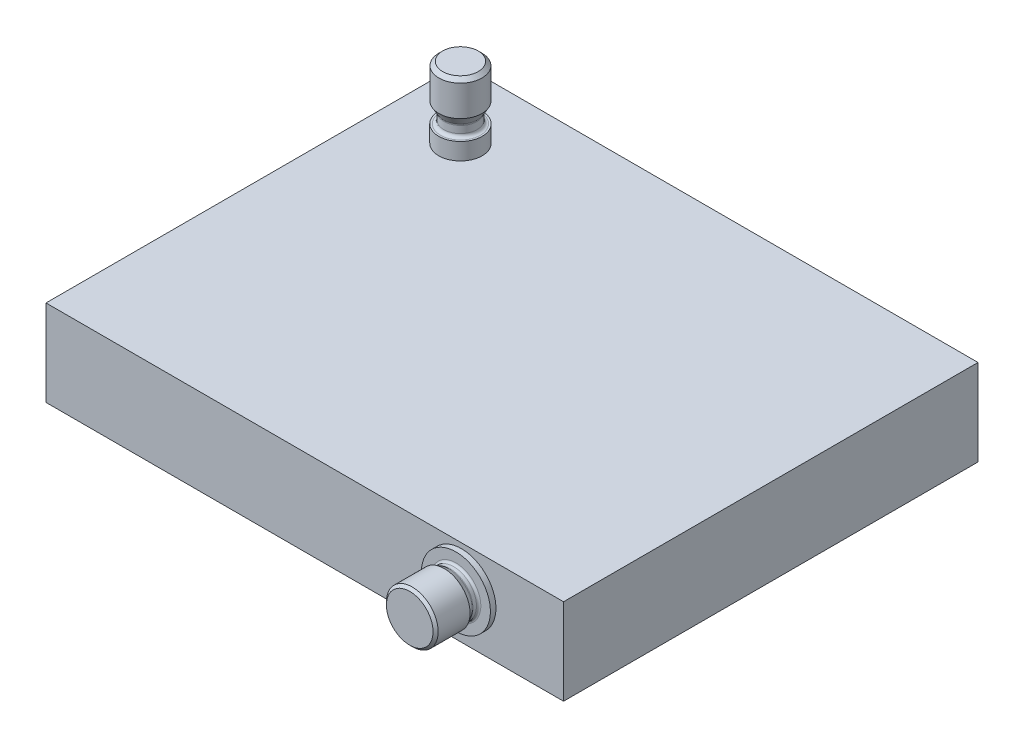
ISO-10303-21;
HEADER;
FILE_DESCRIPTION(('STEP AP214'),'2;1');
FILE_NAME('part.step','',(''),(''),'','','');
FILE_SCHEMA(('AUTOMOTIVE_DESIGN { 1 0 10303 214 1 1 1 1 }'));
ENDSEC;
DATA;
#1=APPLICATION_CONTEXT('core data for automotive mechanical design processes');
#2=APPLICATION_PROTOCOL_DEFINITION('international standard','automotive_design',2000,#1);
#3=PRODUCT_CONTEXT('',#1,'mechanical');
#4=PRODUCT('Part','Part','',(#3));
#5=PRODUCT_RELATED_PRODUCT_CATEGORY('part','',(#4));
#6=PRODUCT_DEFINITION_FORMATION('','',#4);
#7=PRODUCT_DEFINITION_CONTEXT('part definition',#1,'design');
#8=PRODUCT_DEFINITION('design','',#6,#7);
#9=PRODUCT_DEFINITION_SHAPE('','',#8);
#10=(LENGTH_UNIT() NAMED_UNIT(*) SI_UNIT(.MILLI.,.METRE.));
#11=(NAMED_UNIT(*) PLANE_ANGLE_UNIT() SI_UNIT($,.RADIAN.));
#12=(NAMED_UNIT(*) SI_UNIT($,.STERADIAN.) SOLID_ANGLE_UNIT());
#13=UNCERTAINTY_MEASURE_WITH_UNIT(LENGTH_MEASURE(1.E-05),#10,'distance_accuracy_value','');
#14=(GEOMETRIC_REPRESENTATION_CONTEXT(3) GLOBAL_UNCERTAINTY_ASSIGNED_CONTEXT((#13)) GLOBAL_UNIT_ASSIGNED_CONTEXT((#10,
#11,#12)) REPRESENTATION_CONTEXT('',''));
#15=CARTESIAN_POINT('',(0.,0.,0.));
#16=DIRECTION('',(0.,0.,1.));
#17=DIRECTION('',(1.,0.,0.));
#18=AXIS2_PLACEMENT_3D('',#15,#16,#17);
#19=CARTESIAN_POINT('',(-95.3184759122075,31.75,76.3302112377938));
#20=DIRECTION('',(1.,0.,0.));
#21=DIRECTION('',(0.,0.,-1.));
#22=AXIS2_PLACEMENT_3D('',#19,#20,#21);
#23=PLANE('',#22);
#24=DIRECTION('',(0.,0.,1.));
#25=VECTOR('',#24,1.);
#26=CARTESIAN_POINT('',(-95.3184759122075,0.,76.3302112377938));
#27=LINE('',#26,#25);
#28=CARTESIAN_POINT('',(-95.3184759122075,0.,-76.3302112377938));
#29=VERTEX_POINT('',#28);
#30=CARTESIAN_POINT('',(-95.3184759122075,0.,76.3302112377938));
#31=VERTEX_POINT('',#30);
#32=EDGE_CURVE('E107',#29,#31,#27,.T.);
#33=ORIENTED_EDGE('',*,*,#32,.T.);
#34=DIRECTION('',(0.,-1.,0.));
#35=VECTOR('',#34,1.);
#36=CARTESIAN_POINT('',(-95.3184759122075,31.75,76.3302112377938));
#37=LINE('',#36,#35);
#38=CARTESIAN_POINT('',(-95.3184759122075,31.75,76.3302112377938));
#39=VERTEX_POINT('',#38);
#40=EDGE_CURVE('E49',#39,#31,#37,.T.);
#41=ORIENTED_EDGE('',*,*,#40,.F.);
#42=DIRECTION('',(0.,0.,1.));
#43=VECTOR('',#42,1.);
#44=CARTESIAN_POINT('',(-95.3184759122075,31.75,76.3302112377938));
#45=LINE('',#44,#43);
#46=CARTESIAN_POINT('',(-95.3184759122075,31.75,-76.3302112377938));
#47=VERTEX_POINT('',#46);
#48=EDGE_CURVE('E93',#47,#39,#45,.T.);
#49=ORIENTED_EDGE('',*,*,#48,.F.);
#50=DIRECTION('',(0.,-1.,0.));
#51=VECTOR('',#50,1.);
#52=CARTESIAN_POINT('',(-95.3184759122075,31.75,-76.3302112377938));
#53=LINE('',#52,#51);
#54=EDGE_CURVE('E103',#47,#29,#53,.T.);
#55=ORIENTED_EDGE('',*,*,#54,.T.);
#56=EDGE_LOOP('',(#33,#41,#49,#55));
#57=FACE_BOUND('',#56,.T.);
#58=ADVANCED_FACE('F41',(#57),#23,.F.);
#59=CARTESIAN_POINT('',(-95.3184759122075,31.75,76.3302112377938));
#60=DIRECTION('',(0.,0.,-1.));
#61=DIRECTION('',(-1.,0.,0.));
#62=AXIS2_PLACEMENT_3D('',#59,#60,#61);
#63=PLANE('',#62);
#64=CARTESIAN_POINT('',(57.7141358169902,17.1883125671857,76.3302112377938));
#65=DIRECTION('',(0.,0.,-1.));
#66=DIRECTION('',(-1.,0.,0.));
#67=AXIS2_PLACEMENT_3D('',#64,#65,#66);
#68=CIRCLE('',#67,12.7);
#69=CARTESIAN_POINT('',(45.0141358169902,17.1883125671857,76.3302112377938));
#70=VERTEX_POINT('',#69);
#71=EDGE_CURVE('E397',#70,#70,#68,.T.);
#72=ORIENTED_EDGE('',*,*,#71,.T.);
#73=EDGE_LOOP('',(#72));
#74=FACE_BOUND('',#73,.T.);
#75=DIRECTION('',(1.,0.,0.));
#76=VECTOR('',#75,1.);
#77=CARTESIAN_POINT('',(-95.3184759122075,0.,76.3302112377938));
#78=LINE('',#77,#76);
#79=CARTESIAN_POINT('',(95.3184759122075,0.,76.3302112377938));
#80=VERTEX_POINT('',#79);
#81=EDGE_CURVE('E98',#31,#80,#78,.T.);
#82=ORIENTED_EDGE('',*,*,#81,.T.);
#83=DIRECTION('',(0.,-1.,0.));
#84=VECTOR('',#83,1.);
#85=CARTESIAN_POINT('',(95.3184759122075,31.75,76.3302112377938));
#86=LINE('',#85,#84);
#87=CARTESIAN_POINT('',(95.3184759122075,31.75,76.3302112377938));
#88=VERTEX_POINT('',#87);
#89=EDGE_CURVE('E96',#88,#80,#86,.T.);
#90=ORIENTED_EDGE('',*,*,#89,.F.);
#91=DIRECTION('',(1.,0.,0.));
#92=VECTOR('',#91,1.);
#93=CARTESIAN_POINT('',(-95.3184759122075,31.75,76.3302112377938));
#94=LINE('',#93,#92);
#95=EDGE_CURVE('E88',#39,#88,#94,.T.);
#96=ORIENTED_EDGE('',*,*,#95,.F.);
#97=ORIENTED_EDGE('',*,*,#40,.T.);
#98=EDGE_LOOP('',(#82,#90,#96,#97));
#99=FACE_BOUND('',#98,.T.);
#100=ADVANCED_FACE('F97',(#74,#99),#63,.F.);
#101=CARTESIAN_POINT('',(95.3184759122075,31.75,76.3302112377938));
#102=DIRECTION('',(-1.,0.,0.));
#103=DIRECTION('',(0.,0.,1.));
#104=AXIS2_PLACEMENT_3D('',#101,#102,#103);
#105=PLANE('',#104);
#106=DIRECTION('',(0.,0.,-1.));
#107=VECTOR('',#106,1.);
#108=CARTESIAN_POINT('',(95.3184759122075,0.,76.3302112377938));
#109=LINE('',#108,#107);
#110=CARTESIAN_POINT('',(95.3184759122075,0.,-76.3302112377938));
#111=VERTEX_POINT('',#110);
#112=EDGE_CURVE('E74',#80,#111,#109,.T.);
#113=ORIENTED_EDGE('',*,*,#112,.T.);
#114=DIRECTION('',(0.,-1.,0.));
#115=VECTOR('',#114,1.);
#116=CARTESIAN_POINT('',(95.3184759122075,31.75,-76.3302112377938));
#117=LINE('',#116,#115);
#118=CARTESIAN_POINT('',(95.3184759122075,31.75,-76.3302112377938));
#119=VERTEX_POINT('',#118);
#120=EDGE_CURVE('E99',#119,#111,#117,.T.);
#121=ORIENTED_EDGE('',*,*,#120,.F.);
#122=DIRECTION('',(0.,0.,-1.));
#123=VECTOR('',#122,1.);
#124=CARTESIAN_POINT('',(95.3184759122075,31.75,76.3302112377938));
#125=LINE('',#124,#123);
#126=EDGE_CURVE('E91',#88,#119,#125,.T.);
#127=ORIENTED_EDGE('',*,*,#126,.F.);
#128=ORIENTED_EDGE('',*,*,#89,.T.);
#129=EDGE_LOOP('',(#113,#121,#127,#128));
#130=FACE_BOUND('',#129,.T.);
#131=ADVANCED_FACE('F101',(#130),#105,.F.);
#132=CARTESIAN_POINT('',(-95.3184759122075,31.75,-76.3302112377938));
#133=DIRECTION('',(0.,0.,1.));
#134=DIRECTION('',(1.,0.,0.));
#135=AXIS2_PLACEMENT_3D('',#132,#133,#134);
#136=PLANE('',#135);
#137=DIRECTION('',(-1.,0.,0.));
#138=VECTOR('',#137,1.);
#139=CARTESIAN_POINT('',(-95.3184759122075,0.,-76.3302112377938));
#140=LINE('',#139,#138);
#141=EDGE_CURVE('E80',#111,#29,#140,.T.);
#142=ORIENTED_EDGE('',*,*,#141,.T.);
#143=ORIENTED_EDGE('',*,*,#54,.F.);
#144=DIRECTION('',(-1.,0.,0.));
#145=VECTOR('',#144,1.);
#146=CARTESIAN_POINT('',(-95.3184759122075,31.75,-76.3302112377938));
#147=LINE('',#146,#145);
#148=EDGE_CURVE('E57',#119,#47,#147,.T.);
#149=ORIENTED_EDGE('',*,*,#148,.F.);
#150=ORIENTED_EDGE('',*,*,#120,.T.);
#151=EDGE_LOOP('',(#142,#143,#149,#150));
#152=FACE_BOUND('',#151,.T.);
#153=ADVANCED_FACE('F130',(#152),#136,.F.);
#154=CARTESIAN_POINT('',(0.,31.75,0.));
#155=DIRECTION('',(0.,-1.,0.));
#156=DIRECTION('',(0.,0.,-1.));
#157=AXIS2_PLACEMENT_3D('',#154,#155,#156);
#158=PLANE('',#157);
#159=CARTESIAN_POINT('',(-69.9184759122075,31.75,-50.9302112377938));
#160=DIRECTION('',(0.,-1.,0.));
#161=DIRECTION('',(0.,0.,-1.));
#162=AXIS2_PLACEMENT_3D('',#159,#160,#161);
#163=CIRCLE('',#162,8.001);
#164=CARTESIAN_POINT('',(-69.9184759122075,31.75,-58.9312112377939));
#165=VERTEX_POINT('',#164);
#166=EDGE_CURVE('E11',#165,#165,#163,.F.);
#167=ORIENTED_EDGE('',*,*,#166,.F.);
#168=EDGE_LOOP('',(#167));
#169=FACE_BOUND('',#168,.T.);
#170=ORIENTED_EDGE('',*,*,#48,.T.);
#171=ORIENTED_EDGE('',*,*,#95,.T.);
#172=ORIENTED_EDGE('',*,*,#126,.T.);
#173=ORIENTED_EDGE('',*,*,#148,.T.);
#174=EDGE_LOOP('',(#170,#171,#172,#173));
#175=FACE_BOUND('',#174,.T.);
#176=ADVANCED_FACE('F89',(#169,#175),#158,.F.);
#177=CARTESIAN_POINT('',(0.,0.,0.));
#178=DIRECTION('',(0.,-1.,0.));
#179=DIRECTION('',(0.,0.,-1.));
#180=AXIS2_PLACEMENT_3D('',#177,#178,#179);
#181=PLANE('',#180);
#182=ORIENTED_EDGE('',*,*,#32,.F.);
#183=ORIENTED_EDGE('',*,*,#141,.F.);
#184=ORIENTED_EDGE('',*,*,#112,.F.);
#185=ORIENTED_EDGE('',*,*,#81,.F.);
#186=EDGE_LOOP('',(#182,#183,#184,#185));
#187=FACE_BOUND('',#186,.T.);
#188=ADVANCED_FACE('F118',(#187),#181,.T.);
#189=CARTESIAN_POINT('',(-69.9184759122075,57.912,-50.9302112377938));
#190=DIRECTION('',(0.,-1.,0.));
#191=DIRECTION('',(0.,0.,-1.));
#192=AXIS2_PLACEMENT_3D('',#189,#190,#191);
#193=CYLINDRICAL_SURFACE('',#192,8.001);
#194=CARTESIAN_POINT('',(-69.9184759122075,37.9727656062742,-50.9302112377938));
#195=DIRECTION('',(0.,-1.,0.));
#196=DIRECTION('',(0.,0.,-1.));
#197=AXIS2_PLACEMENT_3D('',#194,#195,#196);
#198=CIRCLE('',#197,8.001);
#199=CARTESIAN_POINT('',(-69.9184759122075,37.9727656062742,-58.9312112377939));
#200=VERTEX_POINT('',#199);
#201=EDGE_CURVE('E405',#200,#200,#198,.T.);
#202=CARTESIAN_POINT('',(-69.9184759122075,37.9727656062742,-58.9312112377939));
#203=CARTESIAN_POINT('',(-69.9184759122075,37.9079451312089,-58.9312112377939));
#204=CARTESIAN_POINT('',(-69.9184759122075,37.8431246561435,-58.9312112377939));
#205=CARTESIAN_POINT('',(-69.9184759122075,37.7134837060128,-58.9312112377939));
#206=CARTESIAN_POINT('',(-69.9184759122075,37.6486632309474,-58.9312112377939));
#207=CARTESIAN_POINT('',(-69.9184759122075,37.5190222808167,-58.9312112377939));
#208=CARTESIAN_POINT('',(-69.9184759122075,37.4542018057514,-58.9312112377939));
#209=CARTESIAN_POINT('',(-69.9184759122075,37.3245608556207,-58.9312112377939));
#210=CARTESIAN_POINT('',(-69.9184759122075,37.2597403805553,-58.9312112377939));
#211=CARTESIAN_POINT('',(-69.9184759122075,37.1300994304246,-58.9312112377939));
#212=CARTESIAN_POINT('',(-69.9184759122075,37.0652789553592,-58.9312112377939));
#213=CARTESIAN_POINT('',(-69.9184759122075,36.9356380052285,-58.9312112377939));
#214=CARTESIAN_POINT('',(-69.9184759122075,36.8708175301632,-58.9312112377939));
#215=CARTESIAN_POINT('',(-69.9184759122075,36.7411765800325,-58.9312112377939));
#216=CARTESIAN_POINT('',(-69.9184759122075,36.6763561049671,-58.9312112377939));
#217=CARTESIAN_POINT('',(-69.9184759122075,36.5467151548364,-58.9312112377939));
#218=CARTESIAN_POINT('',(-69.9184759122075,36.481894679771,-58.9312112377939));
#219=CARTESIAN_POINT('',(-69.9184759122075,36.3522537296403,-58.9312112377939));
#220=CARTESIAN_POINT('',(-69.9184759122075,36.2874332545749,-58.9312112377939));
#221=CARTESIAN_POINT('',(-69.9184759122075,36.1577923044442,-58.9312112377939));
#222=CARTESIAN_POINT('',(-69.9184759122075,36.0929718293789,-58.9312112377939));
#223=CARTESIAN_POINT('',(-69.9184759122075,35.9633308792482,-58.9312112377939));
#224=CARTESIAN_POINT('',(-69.9184759122075,35.8985104041828,-58.9312112377939));
#225=CARTESIAN_POINT('',(-69.9184759122075,35.7688694540521,-58.9312112377939));
#226=CARTESIAN_POINT('',(-69.9184759122075,35.7040489789867,-58.9312112377939));
#227=CARTESIAN_POINT('',(-69.9184759122075,35.574408028856,-58.9312112377939));
#228=CARTESIAN_POINT('',(-69.9184759122075,35.5095875537907,-58.9312112377939));
#229=CARTESIAN_POINT('',(-69.9184759122075,35.37994660366,-58.9312112377939));
#230=CARTESIAN_POINT('',(-69.9184759122075,35.3151261285946,-58.9312112377939));
#231=CARTESIAN_POINT('',(-69.9184759122075,35.1854851784639,-58.9312112377939));
#232=CARTESIAN_POINT('',(-69.9184759122075,35.1206647033985,-58.9312112377939));
#233=CARTESIAN_POINT('',(-69.9184759122075,34.9910237532678,-58.9312112377939));
#234=CARTESIAN_POINT('',(-69.9184759122075,34.9262032782025,-58.9312112377939));
#235=CARTESIAN_POINT('',(-69.9184759122075,34.7965623280718,-58.9312112377939));
#236=CARTESIAN_POINT('',(-69.9184759122075,34.7317418530064,-58.9312112377939));
#237=CARTESIAN_POINT('',(-69.9184759122075,34.6021009028757,-58.9312112377939));
#238=CARTESIAN_POINT('',(-69.9184759122075,34.5372804278103,-58.9312112377939));
#239=CARTESIAN_POINT('',(-69.9184759122075,34.4076394776796,-58.9312112377939));
#240=CARTESIAN_POINT('',(-69.9184759122075,34.3428190026143,-58.9312112377939));
#241=CARTESIAN_POINT('',(-69.9184759122075,34.2131780524835,-58.9312112377939));
#242=CARTESIAN_POINT('',(-69.9184759122075,34.1483575774182,-58.9312112377939));
#243=CARTESIAN_POINT('',(-69.9184759122075,34.0187166272875,-58.9312112377939));
#244=CARTESIAN_POINT('',(-69.9184759122075,33.9538961522221,-58.9312112377939));
#245=CARTESIAN_POINT('',(-69.9184759122075,33.8242552020914,-58.9312112377939));
#246=CARTESIAN_POINT('',(-69.9184759122075,33.7594347270261,-58.9312112377939));
#247=CARTESIAN_POINT('',(-69.9184759122075,33.6297937768953,-58.9312112377939));
#248=CARTESIAN_POINT('',(-69.9184759122075,33.56497330183,-58.9312112377939));
#249=CARTESIAN_POINT('',(-69.9184759122075,33.4353323516993,-58.9312112377939));
#250=CARTESIAN_POINT('',(-69.9184759122075,33.3705118766339,-58.9312112377939));
#251=CARTESIAN_POINT('',(-69.9184759122075,33.2408709265032,-58.9312112377939));
#252=CARTESIAN_POINT('',(-69.9184759122075,33.1760504514378,-58.9312112377939));
#253=CARTESIAN_POINT('',(-69.9184759122075,33.0464095013071,-58.9312112377939));
#254=CARTESIAN_POINT('',(-69.9184759122075,32.9815890262418,-58.9312112377939));
#255=CARTESIAN_POINT('',(-69.9184759122075,32.8519480761111,-58.9312112377939));
#256=CARTESIAN_POINT('',(-69.9184759122075,32.7871276010457,-58.9312112377939));
#257=CARTESIAN_POINT('',(-69.9184759122075,32.657486650915,-58.9312112377939));
#258=CARTESIAN_POINT('',(-69.9184759122075,32.5926661758496,-58.9312112377939));
#259=CARTESIAN_POINT('',(-69.9184759122075,32.4630252257189,-58.9312112377939));
#260=CARTESIAN_POINT('',(-69.9184759122075,32.3982047506536,-58.9312112377939));
#261=CARTESIAN_POINT('',(-69.9184759122075,32.2685638005229,-58.9312112377939));
#262=CARTESIAN_POINT('',(-69.9184759122075,32.2037433254575,-58.9312112377939));
#263=CARTESIAN_POINT('',(-69.9184759122075,32.0741023753268,-58.9312112377939));
#264=CARTESIAN_POINT('',(-69.9184759122075,32.0092819002614,-58.9312112377939));
#265=CARTESIAN_POINT('',(-69.9184759122075,31.8796409501307,-58.9312112377939));
#266=CARTESIAN_POINT('',(-69.9184759122075,31.8148204750654,-58.9312112377939));
#267=CARTESIAN_POINT('',(-69.9184759122075,31.75,-58.9312112377939));
#268=B_SPLINE_CURVE_WITH_KNOTS('',3,(#202,#203,#204,#205,#206,#207,#208,#209,#210,#211,#212,
#213,#214,#215,#216,#217,#218,#219,#220,#221,#222,#223,#224,#225,#226,#227,#228,#229,#230,#231,
#232,#233,#234,#235,#236,#237,#238,#239,#240,#241,#242,#243,#244,#245,#246,#247,#248,#249,#250,
#251,#252,#253,#254,#255,#256,#257,#258,#259,#260,#261,#262,#263,#264,#265,#266,#267),
.UNSPECIFIED.,.F.,.F.,(4,2,2,2,2,2,2,2,2,2,2,2,2,2,2,2,2,2,2,2,2,2,2,2,2,2,2,2,2,2,2,2,4),(0.,
0.194461425196066,0.388922850392132,0.583384275588204,0.777845700784277,0.972307125980343,
1.16676855117641,1.36122997637248,1.55569140156855,1.75015282676462,1.94461425196069,
2.13907567715676,2.33353710235283,2.5279985275489,2.72245995274496,2.91692137794104,
3.11138280313711,3.30584422833317,3.50030565352924,3.69476707872531,3.88922850392139,
4.08368992911745,4.27815135431352,4.47261277950959,4.66707420470566,4.86153562990173,
5.05599705509779,5.25045848029387,5.44491990548994,5.63938133068601,5.83384275588207,
6.02830418107814,6.22276560627422),.UNSPECIFIED.);
#269=EDGE_CURVE('BSEAM120',#200,#165,#268,.T.);
#270=ORIENTED_EDGE('',*,*,#201,.T.);
#271=ORIENTED_EDGE('',*,*,#166,.T.);
#272=ORIENTED_EDGE('',*,*,#269,.T.);
#273=ORIENTED_EDGE('',*,*,#269,.F.);
#274=EDGE_LOOP('',(#270,#272,#271,#273));
#275=FACE_BOUND('',#274,.T.);
#276=ADVANCED_FACE('F120',(#275),#193,.T.);
#277=CARTESIAN_POINT('',(-69.9184759122075,57.912,-50.9302112377938));
#278=DIRECTION('',(0.,-1.,0.));
#279=DIRECTION('',(0.,0.,-1.));
#280=AXIS2_PLACEMENT_3D('',#277,#278,#279);
#281=CYLINDRICAL_SURFACE('',#280,7.9375);
#282=CARTESIAN_POINT('',(-69.9184759122075,45.212,-50.9302112377938));
#283=DIRECTION('',(0.,-1.,0.));
#284=DIRECTION('',(0.,0.,-1.));
#285=AXIS2_PLACEMENT_3D('',#282,#283,#284);
#286=CIRCLE('',#285,7.9375);
#287=CARTESIAN_POINT('',(-69.9184759122075,45.212,-58.8677112377938));
#288=VERTEX_POINT('',#287);
#289=EDGE_CURVE('E110',#288,#288,#286,.T.);
#290=ORIENTED_EDGE('',*,*,#289,.F.);
#291=EDGE_LOOP('',(#290));
#292=FACE_BOUND('',#291,.T.);
#293=CARTESIAN_POINT('',(-69.9184759122075,56.53786,-50.9302112377938));
#294=DIRECTION('',(0.,-1.,0.));
#295=DIRECTION('',(0.,0.,-1.));
#296=AXIS2_PLACEMENT_3D('',#293,#294,#295);
#297=CIRCLE('',#296,7.9375);
#298=CARTESIAN_POINT('',(-69.9184759122075,56.53786,-58.8677112377938));
#299=VERTEX_POINT('',#298);
#300=EDGE_CURVE('E399',#299,#299,#297,.T.);
#301=ORIENTED_EDGE('',*,*,#300,.T.);
#302=EDGE_LOOP('',(#301));
#303=FACE_BOUND('',#302,.T.);
#304=ADVANCED_FACE('F127',(#292,#303),#281,.T.);
#305=CARTESIAN_POINT('',(-69.9184759122075,45.212,-50.9302112377938));
#306=DIRECTION('',(0.,1.,0.));
#307=DIRECTION('',(0.,0.,1.));
#308=AXIS2_PLACEMENT_3D('',#305,#306,#307);
#309=CONICAL_SURFACE('',#308,7.9375,0.523598775598297);
#310=CARTESIAN_POINT('',(-69.9184759122075,42.3727679822742,-50.9302112377938));
#311=DIRECTION('',(0.,-1.,0.));
#312=DIRECTION('',(0.,0.,-1.));
#313=AXIS2_PLACEMENT_3D('',#310,#311,#312);
#314=CIRCLE('',#313,6.29826863027422);
#315=CARTESIAN_POINT('',(-69.9184759122075,42.3727679822742,-57.2284798680681));
#316=VERTEX_POINT('',#315);
#317=EDGE_CURVE('E417',#316,#316,#314,.T.);
#318=ORIENTED_EDGE('',*,*,#317,.F.);
#319=EDGE_LOOP('',(#318));
#320=FACE_BOUND('',#319,.T.);
#321=ORIENTED_EDGE('',*,*,#289,.T.);
#322=EDGE_LOOP('',(#321));
#323=FACE_BOUND('',#322,.T.);
#324=ADVANCED_FACE('F172',(#320,#323),#309,.T.);
#325=CARTESIAN_POINT('',(-69.9184759122075,41.7727676582742,-50.9302112377938));
#326=DIRECTION('',(0.,-1.,0.));
#327=DIRECTION('',(0.,0.,-1.));
#328=AXIS2_PLACEMENT_3D('',#325,#326,#327);
#329=TOROIDAL_SURFACE('',#328,7.33749967599999,1.20000064799999);
#330=CARTESIAN_POINT('',(-69.9184759122075,41.7727676582742,-50.9302112377938));
#331=DIRECTION('',(0.,-1.,0.));
#332=DIRECTION('',(0.,0.,-1.));
#333=AXIS2_PLACEMENT_3D('',#330,#331,#332);
#334=CIRCLE('',#333,6.137499028);
#335=CARTESIAN_POINT('',(-69.9184759122075,41.7727676582742,-57.0677102657938));
#336=VERTEX_POINT('',#335);
#337=EDGE_CURVE('E414',#336,#336,#334,.T.);
#338=ORIENTED_EDGE('',*,*,#337,.F.);
#339=EDGE_LOOP('',(#338));
#340=FACE_BOUND('',#339,.T.);
#341=ORIENTED_EDGE('',*,*,#317,.T.);
#342=EDGE_LOOP('',(#341));
#343=FACE_BOUND('',#342,.T.);
#344=ADVANCED_FACE('F185',(#340,#343),#329,.F.);
#345=CARTESIAN_POINT('',(-69.9184759122075,57.912,-50.9302112377938));
#346=DIRECTION('',(0.,-1.,0.));
#347=DIRECTION('',(0.,0.,-1.));
#348=AXIS2_PLACEMENT_3D('',#345,#346,#347);
#349=CYLINDRICAL_SURFACE('',#348,6.137499028);
#350=CARTESIAN_POINT('',(-69.9184759122075,39.1727662542742,-50.9302112377938));
#351=DIRECTION('',(0.,-1.,0.));
#352=DIRECTION('',(0.,0.,-1.));
#353=AXIS2_PLACEMENT_3D('',#350,#351,#352);
#354=CIRCLE('',#353,6.137499028);
#355=CARTESIAN_POINT('',(-69.9184759122075,39.1727662542742,-57.0677102657938));
#356=VERTEX_POINT('',#355);
#357=EDGE_CURVE('E411',#356,#356,#354,.T.);
#358=ORIENTED_EDGE('',*,*,#357,.F.);
#359=EDGE_LOOP('',(#358));
#360=FACE_BOUND('',#359,.T.);
#361=ORIENTED_EDGE('',*,*,#337,.T.);
#362=EDGE_LOOP('',(#361));
#363=FACE_BOUND('',#362,.T.);
#364=ADVANCED_FACE('F196',(#360,#363),#349,.T.);
#365=CARTESIAN_POINT('',(-69.9184759122075,39.1727662542742,-50.9302112377938));
#366=DIRECTION('',(0.,-1.,0.));
#367=DIRECTION('',(0.,0.,-1.));
#368=AXIS2_PLACEMENT_3D('',#365,#366,#367);
#369=TOROIDAL_SURFACE('',#368,7.33749967599999,1.20000064799999);
#370=CARTESIAN_POINT('',(-69.9184759122075,37.9727656062742,-50.9302112377938));
#371=DIRECTION('',(0.,-1.,0.));
#372=DIRECTION('',(0.,0.,-1.));
#373=AXIS2_PLACEMENT_3D('',#370,#371,#372);
#374=CIRCLE('',#373,7.33749967599999);
#375=CARTESIAN_POINT('',(-69.9184759122075,37.9727656062742,-58.2677109137938));
#376=VERTEX_POINT('',#375);
#377=EDGE_CURVE('E408',#376,#376,#374,.T.);
#378=ORIENTED_EDGE('',*,*,#377,.F.);
#379=EDGE_LOOP('',(#378));
#380=FACE_BOUND('',#379,.T.);
#381=ORIENTED_EDGE('',*,*,#357,.T.);
#382=EDGE_LOOP('',(#381));
#383=FACE_BOUND('',#382,.T.);
#384=ADVANCED_FACE('F207',(#380,#383),#369,.F.);
#385=CARTESIAN_POINT('',(-62.5809762362075,37.9727656062742,-50.9302112377938));
#386=DIRECTION('',(0.,-1.,0.));
#387=DIRECTION('',(0.,0.,-1.));
#388=AXIS2_PLACEMENT_3D('',#385,#386,#387);
#389=PLANE('',#388);
#390=ORIENTED_EDGE('',*,*,#201,.F.);
#391=EDGE_LOOP('',(#390));
#392=FACE_BOUND('',#391,.T.);
#393=ORIENTED_EDGE('',*,*,#377,.T.);
#394=EDGE_LOOP('',(#393));
#395=FACE_BOUND('',#394,.T.);
#396=ADVANCED_FACE('F218',(#392,#395),#389,.F.);
#397=CARTESIAN_POINT('',(-69.9184759122075,57.912,-50.9302112377938));
#398=DIRECTION('',(0.,-1.,0.));
#399=DIRECTION('',(0.,0.,-1.));
#400=AXIS2_PLACEMENT_3D('',#397,#398,#399);
#401=CONICAL_SURFACE('',#400,6.56336,0.785398163397448);
#402=ORIENTED_EDGE('',*,*,#300,.F.);
#403=EDGE_LOOP('',(#402));
#404=FACE_BOUND('',#403,.T.);
#405=CARTESIAN_POINT('',(-69.9184759122075,57.912,-50.9302112377938));
#406=DIRECTION('',(0.,-1.,0.));
#407=DIRECTION('',(0.,0.,-1.));
#408=AXIS2_PLACEMENT_3D('',#405,#406,#407);
#409=CIRCLE('',#408,6.56336);
#410=CARTESIAN_POINT('',(-69.9184759122075,57.912,-57.4935712377939));
#411=VERTEX_POINT('',#410);
#412=EDGE_CURVE('E402',#411,#411,#409,.T.);
#413=ORIENTED_EDGE('',*,*,#412,.T.);
#414=EDGE_LOOP('',(#413));
#415=FACE_BOUND('',#414,.T.);
#416=ADVANCED_FACE('F229',(#404,#415),#401,.T.);
#417=CARTESIAN_POINT('',(-69.9184759122075,57.912,-50.9302112377938));
#418=DIRECTION('',(0.,1.,0.));
#419=DIRECTION('',(0.,0.,1.));
#420=AXIS2_PLACEMENT_3D('',#417,#418,#419);
#421=PLANE('',#420);
#422=ORIENTED_EDGE('',*,*,#412,.F.);
#423=EDGE_LOOP('',(#422));
#424=FACE_BOUND('',#423,.T.);
#425=ADVANCED_FACE('F239',(#424),#421,.T.);
#426=CARTESIAN_POINT('',(57.7141358169902,17.1883125671857,76.3302112377938));
#427=DIRECTION('',(0.,0.,-1.));
#428=DIRECTION('',(-1.,0.,0.));
#429=AXIS2_PLACEMENT_3D('',#426,#427,#428);
#430=CYLINDRICAL_SURFACE('',#429,12.7);
#431=CARTESIAN_POINT('',(57.7141358169902,17.1883125671857,78.3739911297871));
#432=DIRECTION('',(0.,0.,-1.));
#433=DIRECTION('',(-1.,0.,0.));
#434=AXIS2_PLACEMENT_3D('',#431,#432,#433);
#435=CIRCLE('',#434,12.7);
#436=CARTESIAN_POINT('',(45.0141358169902,17.1883125671857,78.3739911297871));
#437=VERTEX_POINT('',#436);
#438=EDGE_CURVE('E394',#437,#437,#435,.T.);
#439=ORIENTED_EDGE('',*,*,#438,.T.);
#440=EDGE_LOOP('',(#439));
#441=FACE_BOUND('',#440,.T.);
#442=ORIENTED_EDGE('',*,*,#71,.F.);
#443=EDGE_LOOP('',(#442));
#444=FACE_BOUND('',#443,.T.);
#445=ADVANCED_FACE('F250',(#441,#444),#430,.T.);
#446=CARTESIAN_POINT('',(66.8891356279902,17.1883125671857,78.3739911297871));
#447=DIRECTION('',(0.,0.,1.));
#448=DIRECTION('',(1.,0.,0.));
#449=AXIS2_PLACEMENT_3D('',#446,#447,#448);
#450=PLANE('',#449);
#451=CARTESIAN_POINT('',(57.7141358169902,17.1883125671857,78.3739911297871));
#452=DIRECTION('',(0.,0.,-1.));
#453=DIRECTION('',(-1.,0.,0.));
#454=AXIS2_PLACEMENT_3D('',#451,#452,#453);
#455=CIRCLE('',#454,9.17499981100001);
#456=CARTESIAN_POINT('',(48.5391360059902,17.1883125671857,78.3739911297871));
#457=VERTEX_POINT('',#456);
#458=EDGE_CURVE('E391',#457,#457,#455,.T.);
#459=ORIENTED_EDGE('',*,*,#458,.T.);
#460=EDGE_LOOP('',(#459));
#461=FACE_BOUND('',#460,.T.);
#462=ORIENTED_EDGE('',*,*,#438,.F.);
#463=EDGE_LOOP('',(#462));
#464=FACE_BOUND('',#463,.T.);
#465=ADVANCED_FACE('F269',(#461,#464),#450,.T.);
#466=CARTESIAN_POINT('',(57.7141358169902,17.1883125671857,79.1739915617871));
#467=DIRECTION('',(0.,0.,-1.));
#468=DIRECTION('',(-1.,0.,0.));
#469=AXIS2_PLACEMENT_3D('',#466,#467,#468);
#470=TOROIDAL_SURFACE('',#469,9.17499981100001,0.800000432);
#471=CARTESIAN_POINT('',(57.7141358169902,17.1883125671857,79.1739915617871));
#472=DIRECTION('',(0.,0.,-1.));
#473=DIRECTION('',(-1.,0.,0.));
#474=AXIS2_PLACEMENT_3D('',#471,#472,#473);
#475=CIRCLE('',#474,8.37499937899999);
#476=CARTESIAN_POINT('',(49.3391364379902,17.1883125671857,79.1739915617871));
#477=VERTEX_POINT('',#476);
#478=EDGE_CURVE('E388',#477,#477,#475,.T.);
#479=ORIENTED_EDGE('',*,*,#478,.T.);
#480=EDGE_LOOP('',(#479));
#481=FACE_BOUND('',#480,.T.);
#482=ORIENTED_EDGE('',*,*,#458,.F.);
#483=EDGE_LOOP('',(#482));
#484=FACE_BOUND('',#483,.T.);
#485=ADVANCED_FACE('F278',(#481,#484),#470,.F.);
#486=CARTESIAN_POINT('',(57.7141358169902,17.1883125671857,76.3302112377938));
#487=DIRECTION('',(0.,0.,-1.));
#488=DIRECTION('',(-1.,0.,0.));
#489=AXIS2_PLACEMENT_3D('',#486,#487,#488);
#490=CYLINDRICAL_SURFACE('',#489,8.374999379);
#491=CARTESIAN_POINT('',(57.7141358169902,17.1883125671857,80.4739922637871));
#492=DIRECTION('',(0.,0.,-1.));
#493=DIRECTION('',(-1.,0.,0.));
#494=AXIS2_PLACEMENT_3D('',#491,#492,#493);
#495=CIRCLE('',#494,8.37499937900001);
#496=CARTESIAN_POINT('',(49.3391364379902,17.1883125671857,80.4739922637871));
#497=VERTEX_POINT('',#496);
#498=EDGE_CURVE('E385',#497,#497,#495,.T.);
#499=ORIENTED_EDGE('',*,*,#498,.T.);
#500=EDGE_LOOP('',(#499));
#501=FACE_BOUND('',#500,.T.);
#502=ORIENTED_EDGE('',*,*,#478,.F.);
#503=EDGE_LOOP('',(#502));
#504=FACE_BOUND('',#503,.T.);
#505=ADVANCED_FACE('F288',(#501,#504),#490,.T.);
#506=CARTESIAN_POINT('',(57.7141358169902,17.1883125671857,80.4739922637871));
#507=DIRECTION('',(0.,0.,-1.));
#508=DIRECTION('',(-1.,0.,0.));
#509=AXIS2_PLACEMENT_3D('',#506,#507,#508);
#510=TOROIDAL_SURFACE('',#509,9.17499981100001,0.800000431999991);
#511=CARTESIAN_POINT('',(57.7141358169902,17.1883125671857,80.8739924797871));
#512=DIRECTION('',(0.,0.,-1.));
#513=DIRECTION('',(-1.,0.,0.));
#514=AXIS2_PLACEMENT_3D('',#511,#512,#513);
#515=CIRCLE('',#514,8.48217911384948);
#516=CARTESIAN_POINT('',(49.2319567031407,17.1883125671857,80.8739924797871));
#517=VERTEX_POINT('',#516);
#518=EDGE_CURVE('E382',#517,#517,#515,.T.);
#519=ORIENTED_EDGE('',*,*,#518,.T.);
#520=EDGE_LOOP('',(#519));
#521=FACE_BOUND('',#520,.T.);
#522=ORIENTED_EDGE('',*,*,#498,.F.);
#523=EDGE_LOOP('',(#522));
#524=FACE_BOUND('',#523,.T.);
#525=ADVANCED_FACE('F298',(#521,#524),#510,.F.);
#526=CARTESIAN_POINT('',(57.7141358169902,17.1883125671857,80.8739924797871));
#527=DIRECTION('',(0.,0.,1.));
#528=DIRECTION('',(1.,0.,0.));
#529=AXIS2_PLACEMENT_3D('',#526,#527,#528);
#530=CONICAL_SURFACE('',#529,8.48217911384948,0.523598775598289);
#531=CARTESIAN_POINT('',(57.7141358169902,17.1883125671857,82.6802112377939));
#532=DIRECTION('',(0.,0.,-1.));
#533=DIRECTION('',(-1.,0.,0.));
#534=AXIS2_PLACEMENT_3D('',#531,#532,#533);
#535=CIRCLE('',#534,9.52500000000001);
#536=CARTESIAN_POINT('',(48.1891358169902,17.1883125671857,82.6802112377939));
#537=VERTEX_POINT('',#536);
#538=EDGE_CURVE('E377',#537,#537,#535,.T.);
#539=ORIENTED_EDGE('',*,*,#538,.T.);
#540=EDGE_LOOP('',(#539));
#541=FACE_BOUND('',#540,.T.);
#542=ORIENTED_EDGE('',*,*,#518,.F.);
#543=EDGE_LOOP('',(#542));
#544=FACE_BOUND('',#543,.T.);
#545=ADVANCED_FACE('F308',(#541,#544),#530,.T.);
#546=CARTESIAN_POINT('',(57.7141358169902,17.1883125671857,76.3302112377938));
#547=DIRECTION('',(0.,0.,-1.));
#548=DIRECTION('',(-1.,0.,0.));
#549=AXIS2_PLACEMENT_3D('',#546,#547,#548);
#550=CYLINDRICAL_SURFACE('',#549,9.52500000000001);
#551=CARTESIAN_POINT('',(57.7141358169902,17.1883125671857,94.4442212377939));
#552=DIRECTION('',(0.,0.,-1.));
#553=DIRECTION('',(-1.,0.,0.));
#554=AXIS2_PLACEMENT_3D('',#551,#552,#553);
#555=CIRCLE('',#554,9.52500000000001);
#556=CARTESIAN_POINT('',(48.1891358169902,17.1883125671857,94.4442212377939));
#557=VERTEX_POINT('',#556);
#558=EDGE_CURVE('E374',#557,#557,#555,.T.);
#559=ORIENTED_EDGE('',*,*,#558,.T.);
#560=EDGE_LOOP('',(#559));
#561=FACE_BOUND('',#560,.T.);
#562=ORIENTED_EDGE('',*,*,#538,.F.);
#563=EDGE_LOOP('',(#562));
#564=FACE_BOUND('',#563,.T.);
#565=ADVANCED_FACE('F318',(#561,#564),#550,.T.);
#566=CARTESIAN_POINT('',(57.7141358169902,17.1883125671857,94.4442212377939));
#567=DIRECTION('',(0.,0.,-1.));
#568=DIRECTION('',(-1.,0.,0.));
#569=AXIS2_PLACEMENT_3D('',#566,#567,#568);
#570=CONICAL_SURFACE('',#569,9.52500000000001,0.785398163397448);
#571=CARTESIAN_POINT('',(57.7141358169902,17.1883125671857,95.3802112377939));
#572=DIRECTION('',(0.,0.,-1.));
#573=DIRECTION('',(-1.,0.,0.));
#574=AXIS2_PLACEMENT_3D('',#571,#572,#573);
#575=CIRCLE('',#574,8.58900999999999);
#576=CARTESIAN_POINT('',(49.1251258169902,17.1883125671857,95.3802112377939));
#577=VERTEX_POINT('',#576);
#578=EDGE_CURVE('E373',#577,#577,#575,.T.);
#579=ORIENTED_EDGE('',*,*,#578,.T.);
#580=EDGE_LOOP('',(#579));
#581=FACE_BOUND('',#580,.T.);
#582=ORIENTED_EDGE('',*,*,#558,.F.);
#583=EDGE_LOOP('',(#582));
#584=FACE_BOUND('',#583,.T.);
#585=ADVANCED_FACE('F328',(#581,#584),#570,.T.);
#586=CARTESIAN_POINT('',(66.3031458169902,17.1883125671857,95.3802112377939));
#587=DIRECTION('',(0.,0.,1.));
#588=DIRECTION('',(1.,0.,0.));
#589=AXIS2_PLACEMENT_3D('',#586,#587,#588);
#590=PLANE('',#589);
#591=ORIENTED_EDGE('',*,*,#578,.F.);
#592=EDGE_LOOP('',(#591));
#593=FACE_BOUND('',#592,.T.);
#594=ADVANCED_FACE('F338',(#593),#590,.T.);
#595=CLOSED_SHELL('',(#58,#100,#131,#153,#176,#188,#276,#304,#324,#344,#364,#384,#396,#416,#425,
#445,#465,#485,#505,#525,#545,#565,#585,#594));
#596=MANIFOLD_SOLID_BREP('B2',#595);
#597=ADVANCED_BREP_SHAPE_REPRESENTATION('',(#18,#596),#14);
#598=SHAPE_DEFINITION_REPRESENTATION(#9,#597);
ENDSEC;
END-ISO-10303-21;
